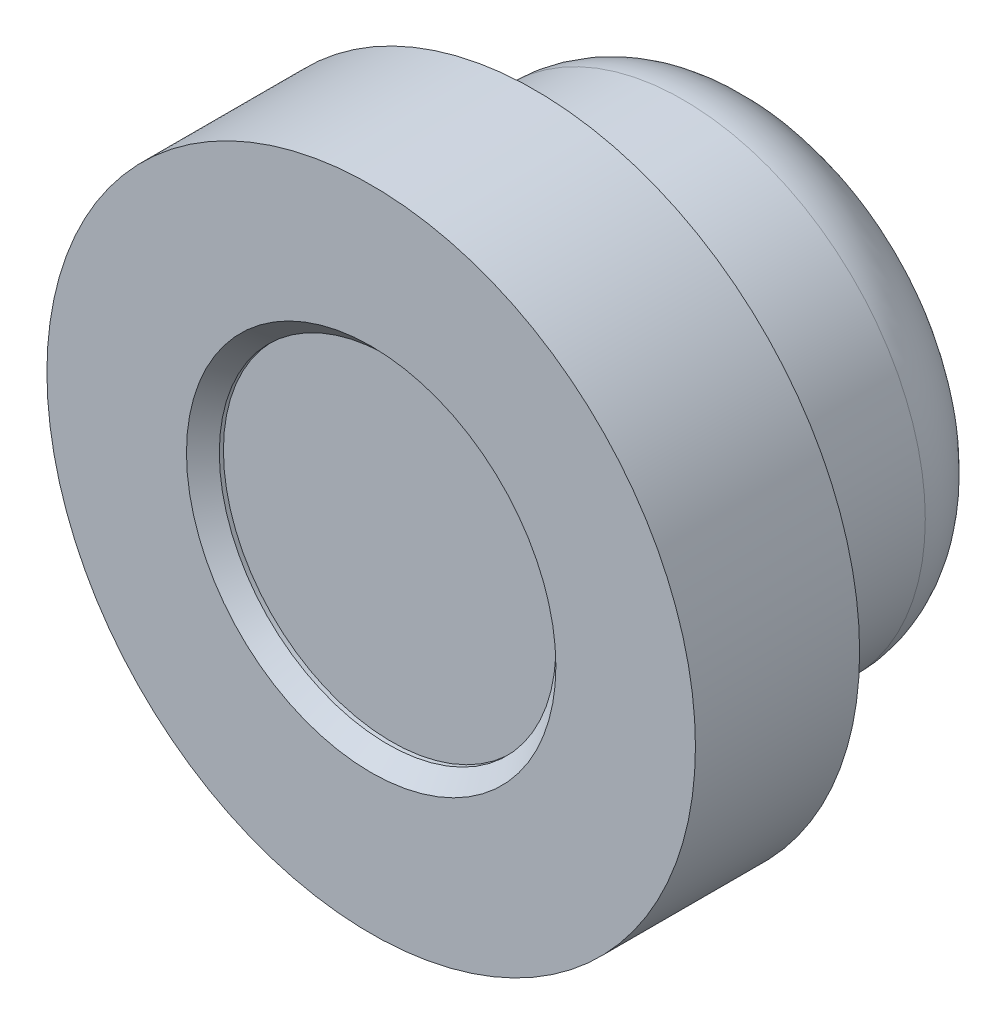
ISO-10303-21;
HEADER;
FILE_DESCRIPTION(('STEP AP214'),'2;1');
FILE_NAME('part.step','',(''),(''),'','','');
FILE_SCHEMA(('AUTOMOTIVE_DESIGN { 1 0 10303 214 1 1 1 1 }'));
ENDSEC;
DATA;
#1=APPLICATION_CONTEXT('core data for automotive mechanical design processes');
#2=APPLICATION_PROTOCOL_DEFINITION('international standard','automotive_design',2000,#1);
#3=PRODUCT_CONTEXT('',#1,'mechanical');
#4=PRODUCT('Part','Part','',(#3));
#5=PRODUCT_RELATED_PRODUCT_CATEGORY('part','',(#4));
#6=PRODUCT_DEFINITION_FORMATION('','',#4);
#7=PRODUCT_DEFINITION_CONTEXT('part definition',#1,'design');
#8=PRODUCT_DEFINITION('design','',#6,#7);
#9=PRODUCT_DEFINITION_SHAPE('','',#8);
#10=(LENGTH_UNIT() NAMED_UNIT(*) SI_UNIT(.MILLI.,.METRE.));
#11=(NAMED_UNIT(*) PLANE_ANGLE_UNIT() SI_UNIT($,.RADIAN.));
#12=(NAMED_UNIT(*) SI_UNIT($,.STERADIAN.) SOLID_ANGLE_UNIT());
#13=UNCERTAINTY_MEASURE_WITH_UNIT(LENGTH_MEASURE(1.E-05),#10,'distance_accuracy_value','');
#14=(GEOMETRIC_REPRESENTATION_CONTEXT(3) GLOBAL_UNCERTAINTY_ASSIGNED_CONTEXT((#13)) GLOBAL_UNIT_ASSIGNED_CONTEXT((#10,
#11,#12)) REPRESENTATION_CONTEXT('',''));
#15=CARTESIAN_POINT('',(0.,0.,0.));
#16=DIRECTION('',(0.,0.,1.));
#17=DIRECTION('',(1.,0.,0.));
#18=AXIS2_PLACEMENT_3D('',#15,#16,#17);
#19=CARTESIAN_POINT('',(12.966856851689,27.5174833037251,-8.12700712680798));
#20=DIRECTION('',(0.,1.31134157754799E-07,-1.));
#21=DIRECTION('',(-1.,0.,0.));
#22=AXIS2_PLACEMENT_3D('',#19,#20,#21);
#23=PLANE('',#22);
#24=CARTESIAN_POINT('',(12.966856851689,27.5174830414568,-8.12700712680801));
#25=DIRECTION('',(0.,-1.31134157754799E-07,1.));
#26=DIRECTION('',(-1.,0.,0.));
#27=AXIS2_PLACEMENT_3D('',#24,#25,#26);
#28=CIRCLE('',#27,2.95);
#29=CARTESIAN_POINT('',(15.916856851689,27.5174830414568,-8.12700712680801));
#30=VERTEX_POINT('',#29);
#31=EDGE_CURVE('E90',#30,#30,#28,.T.);
#32=ORIENTED_EDGE('',*,*,#31,.T.);
#33=EDGE_LOOP('',(#32));
#34=FACE_BOUND('',#33,.T.);
#35=CARTESIAN_POINT('',(12.966856851689,27.5174833037251,-8.12700712680798));
#36=DIRECTION('',(0.,1.31134157754799E-07,-1.));
#37=DIRECTION('',(-1.,0.,0.));
#38=AXIS2_PLACEMENT_3D('',#35,#36,#37);
#39=CIRCLE('',#38,3.95000001490116);
#40=CARTESIAN_POINT('',(16.9168568665902,27.5174833037251,-8.12700712680798));
#41=VERTEX_POINT('',#40);
#42=EDGE_CURVE('E25',#41,#41,#39,.T.);
#43=ORIENTED_EDGE('',*,*,#42,.T.);
#44=EDGE_LOOP('',(#43));
#45=FACE_BOUND('',#44,.T.);
#46=ADVANCED_FACE('F17',(#34,#45),#23,.T.);
#47=CARTESIAN_POINT('',(12.966856851689,27.5174831070239,-6.62700712680799));
#48=DIRECTION('',(0.,1.31134158346905E-07,-1.));
#49=DIRECTION('',(-1.,0.,0.));
#50=AXIS2_PLACEMENT_3D('',#47,#48,#49);
#51=CYLINDRICAL_SURFACE('',#50,3.95000001490116);
#52=ORIENTED_EDGE('',*,*,#42,.F.);
#53=DIRECTION('',(0.,-1.31134158346905E-07,1.));
#54=VECTOR('',#53,1.);
#55=CARTESIAN_POINT('',(16.9168568665902,27.5174831070239,-6.62700712680799));
#56=LINE('',#55,#54);
#57=CARTESIAN_POINT('',(16.9168568665902,27.5174830414568,-6.127007126808));
#58=VERTEX_POINT('',#57);
#59=EDGE_CURVE('E11',#41,#58,#56,.T.);
#60=ORIENTED_EDGE('',*,*,#59,.T.);
#61=CARTESIAN_POINT('',(12.966856851689,27.5174830414568,-6.127007126808));
#62=DIRECTION('',(0.,-1.31134157754799E-07,1.));
#63=DIRECTION('',(-1.,0.,0.));
#64=AXIS2_PLACEMENT_3D('',#61,#62,#63);
#65=CIRCLE('',#64,3.95000001490116);
#66=EDGE_CURVE('E95',#58,#58,#65,.T.);
#67=ORIENTED_EDGE('',*,*,#66,.F.);
#68=ORIENTED_EDGE('',*,*,#59,.F.);
#69=EDGE_LOOP('',(#52,#60,#67,#68));
#70=FACE_BOUND('',#69,.T.);
#71=ADVANCED_FACE('F114',(#70),#51,.T.);
#72=CARTESIAN_POINT('',(12.966856851689,27.5174833233952,-6.37700712680796));
#73=DIRECTION('',(0.,-1.31134157754799E-07,1.));
#74=DIRECTION('',(-1.,0.,0.));
#75=AXIS2_PLACEMENT_3D('',#72,#73,#74);
#76=PLANE('',#75);
#77=CARTESIAN_POINT('',(12.966856851689,27.5174833233952,-6.37700712680796));
#78=DIRECTION('',(0.,1.31134157754799E-07,-1.));
#79=DIRECTION('',(1.,0.,0.));
#80=AXIS2_PLACEMENT_3D('',#77,#78,#79);
#81=CIRCLE('',#80,2.05);
#82=CARTESIAN_POINT('',(10.916856851689,27.5174833233952,-6.37700712680796));
#83=VERTEX_POINT('',#82);
#84=EDGE_CURVE('E105',#83,#83,#81,.T.);
#85=ORIENTED_EDGE('',*,*,#84,.F.);
#86=EDGE_LOOP('',(#85));
#87=FACE_BOUND('',#86,.T.);
#88=ADVANCED_FACE('F116',(#87),#76,.T.);
#89=CARTESIAN_POINT('',(12.966856851689,27.5174830414568,-6.127007126808));
#90=DIRECTION('',(0.,1.31134157754799E-07,-1.));
#91=DIRECTION('',(-1.,0.,0.));
#92=AXIS2_PLACEMENT_3D('',#89,#90,#91);
#93=PLANE('',#92);
#94=CARTESIAN_POINT('',(12.966856851689,27.5174832906117,-6.12700712680796));
#95=DIRECTION('',(0.,-1.31134157754799E-07,1.));
#96=DIRECTION('',(1.,0.,0.));
#97=AXIS2_PLACEMENT_3D('',#94,#95,#96);
#98=CIRCLE('',#97,2.25);
#99=CARTESIAN_POINT('',(10.716856851689,27.5174832906117,-6.12700712680796));
#100=VERTEX_POINT('',#99);
#101=EDGE_CURVE('E85',#100,#100,#98,.T.);
#102=ORIENTED_EDGE('',*,*,#101,.F.);
#103=EDGE_LOOP('',(#102));
#104=FACE_BOUND('',#103,.T.);
#105=ORIENTED_EDGE('',*,*,#66,.T.);
#106=EDGE_LOOP('',(#105));
#107=FACE_BOUND('',#106,.T.);
#108=ADVANCED_FACE('F113',(#104,#107),#93,.F.);
#109=CARTESIAN_POINT('',(12.966856851689,27.5174832906117,-6.12700712680796));
#110=DIRECTION('',(0.,1.311341613075E-07,-1.));
#111=DIRECTION('',(1.,0.,0.));
#112=AXIS2_PLACEMENT_3D('',#109,#110,#111);
#113=CYLINDRICAL_SURFACE('',#112,2.05);
#114=CARTESIAN_POINT('',(12.966856851689,27.5174833168385,-6.32700712680796));
#115=DIRECTION('',(0.,1.31134157754799E-07,-1.));
#116=DIRECTION('',(1.,0.,0.));
#117=AXIS2_PLACEMENT_3D('',#114,#115,#116);
#118=CIRCLE('',#117,2.05);
#119=CARTESIAN_POINT('',(10.916856851689,27.5174833168385,-6.32700712680796));
#120=VERTEX_POINT('',#119);
#121=EDGE_CURVE('E96',#120,#120,#118,.T.);
#122=ORIENTED_EDGE('',*,*,#121,.F.);
#123=DIRECTION('',(0.,1.311341613075E-07,-1.));
#124=VECTOR('',#123,1.);
#125=CARTESIAN_POINT('',(10.916856851689,27.5174832906117,-6.12700712680796));
#126=LINE('',#125,#124);
#127=EDGE_CURVE('E100',#120,#83,#126,.T.);
#128=ORIENTED_EDGE('',*,*,#127,.T.);
#129=ORIENTED_EDGE('',*,*,#84,.T.);
#130=ORIENTED_EDGE('',*,*,#127,.F.);
#131=EDGE_LOOP('',(#122,#128,#129,#130));
#132=FACE_BOUND('',#131,.T.);
#133=ADVANCED_FACE('F128',(#132),#113,.F.);
#134=CARTESIAN_POINT('',(12.966856851689,27.5174833037251,-6.22700712680796));
#135=DIRECTION('',(0.,-1.31134147984824E-07,1.));
#136=DIRECTION('',(1.,0.,0.));
#137=AXIS2_PLACEMENT_3D('',#134,#135,#136);
#138=CONICAL_SURFACE('',#137,2.15,0.78539816339745);
#139=ORIENTED_EDGE('',*,*,#101,.T.);
#140=DIRECTION('',(0.707106781186548,9.27258453717848E-08,-0.707106781186541));
#141=VECTOR('',#140,1.);
#142=CARTESIAN_POINT('',(10.816856851689,27.5174833037251,-6.22700712680796));
#143=LINE('',#142,#141);
#144=EDGE_CURVE('E101',#100,#120,#143,.T.);
#145=ORIENTED_EDGE('',*,*,#144,.T.);
#146=ORIENTED_EDGE('',*,*,#121,.T.);
#147=ORIENTED_EDGE('',*,*,#144,.F.);
#148=EDGE_LOOP('',(#139,#145,#146,#147));
#149=FACE_BOUND('',#148,.T.);
#150=ADVANCED_FACE('F132',(#149),#138,.F.);
#151=CARTESIAN_POINT('',(12.966856851689,27.5174834086325,-10.927007126808));
#152=DIRECTION('',(0.,1.31134157754799E-07,-1.));
#153=DIRECTION('',(-1.,0.,0.));
#154=AXIS2_PLACEMENT_3D('',#151,#152,#153);
#155=PLANE('',#154);
#156=CARTESIAN_POINT('',(12.966856851689,27.5174834086325,-10.927007126808));
#157=DIRECTION('',(0.,-1.31134157754799E-07,1.));
#158=DIRECTION('',(-1.,0.,0.));
#159=AXIS2_PLACEMENT_3D('',#156,#157,#158);
#160=CIRCLE('',#159,1.95);
#161=CARTESIAN_POINT('',(14.916856851689,27.5174834086325,-10.927007126808));
#162=VERTEX_POINT('',#161);
#163=EDGE_CURVE('E72',#162,#162,#160,.T.);
#164=ORIENTED_EDGE('',*,*,#163,.F.);
#165=EDGE_LOOP('',(#164));
#166=FACE_BOUND('',#165,.T.);
#167=ADVANCED_FACE('F136',(#166),#155,.T.);
#168=CARTESIAN_POINT('',(12.966856851689,27.5174830414568,-8.12700712680801));
#169=DIRECTION('',(0.,1.31134157501021E-07,-1.));
#170=DIRECTION('',(-1.,0.,0.));
#171=AXIS2_PLACEMENT_3D('',#168,#169,#170);
#172=CYLINDRICAL_SURFACE('',#171,2.95);
#173=CARTESIAN_POINT('',(12.966856851689,27.5174832774983,-9.927007126808));
#174=DIRECTION('',(0.,1.31134157754799E-07,-1.));
#175=DIRECTION('',(-1.,0.,0.));
#176=AXIS2_PLACEMENT_3D('',#173,#174,#175);
#177=CIRCLE('',#176,2.95);
#178=CARTESIAN_POINT('',(15.916856851689,27.5174832774983,-9.927007126808));
#179=VERTEX_POINT('',#178);
#180=EDGE_CURVE('E74',#179,#179,#177,.T.);
#181=ORIENTED_EDGE('',*,*,#180,.F.);
#182=DIRECTION('',(0.,-1.31134157501021E-07,1.));
#183=VECTOR('',#182,1.);
#184=CARTESIAN_POINT('',(15.916856851689,27.5174830414568,-8.12700712680801));
#185=LINE('',#184,#183);
#186=EDGE_CURVE('E80',#179,#30,#185,.T.);
#187=ORIENTED_EDGE('',*,*,#186,.T.);
#188=ORIENTED_EDGE('',*,*,#31,.F.);
#189=ORIENTED_EDGE('',*,*,#186,.F.);
#190=EDGE_LOOP('',(#181,#187,#188,#189));
#191=FACE_BOUND('',#190,.T.);
#192=ADVANCED_FACE('F140',(#191),#172,.T.);
#193=CARTESIAN_POINT('',(12.966856851689,27.5174832774983,-9.927007126808));
#194=DIRECTION('',(0.,1.31134157754799E-07,-1.));
#195=DIRECTION('',(-1.,0.,0.));
#196=AXIS2_PLACEMENT_3D('',#193,#194,#195);
#197=TOROIDAL_SURFACE('',#196,1.95,1.);
#198=ORIENTED_EDGE('',*,*,#163,.T.);
#199=CARTESIAN_POINT('',(14.916856851689,27.5174832774983,-9.927007126808));
#200=DIRECTION('',(0.,-1.,-1.31134157754799E-07));
#201=DIRECTION('',(1.,0.,0.));
#202=AXIS2_PLACEMENT_3D('',#199,#200,#201);
#203=CIRCLE('',#202,1.);
#204=EDGE_CURVE('E69',#162,#179,#203,.T.);
#205=ORIENTED_EDGE('',*,*,#204,.T.);
#206=ORIENTED_EDGE('',*,*,#180,.T.);
#207=ORIENTED_EDGE('',*,*,#204,.F.);
#208=EDGE_LOOP('',(#198,#205,#206,#207));
#209=FACE_BOUND('',#208,.T.);
#210=ADVANCED_FACE('F70',(#209),#197,.T.);
#211=CLOSED_SHELL('',(#46,#71,#88,#108,#133,#150,#167,#192,#210));
#212=MANIFOLD_SOLID_BREP('B1',#211);
#213=ADVANCED_BREP_SHAPE_REPRESENTATION('',(#18,#212),#14);
#214=SHAPE_DEFINITION_REPRESENTATION(#9,#213);
ENDSEC;
END-ISO-10303-21;
